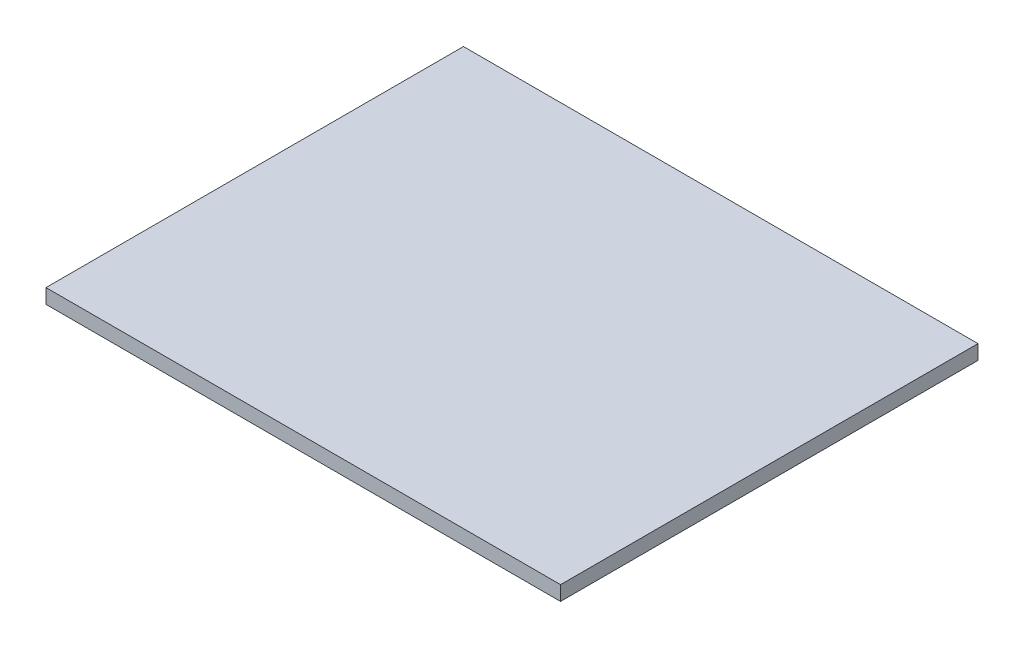
ISO-10303-21;
HEADER;
FILE_DESCRIPTION(('STEP AP214'),'2;1');
FILE_NAME('part.step','',(''),(''),'','','');
FILE_SCHEMA(('AUTOMOTIVE_DESIGN { 1 0 10303 214 1 1 1 1 }'));
ENDSEC;
DATA;
#1=APPLICATION_CONTEXT('core data for automotive mechanical design processes');
#2=APPLICATION_PROTOCOL_DEFINITION('international standard','automotive_design',2000,#1);
#3=PRODUCT_CONTEXT('',#1,'mechanical');
#4=PRODUCT('Part','Part','',(#3));
#5=PRODUCT_RELATED_PRODUCT_CATEGORY('part','',(#4));
#6=PRODUCT_DEFINITION_FORMATION('','',#4);
#7=PRODUCT_DEFINITION_CONTEXT('part definition',#1,'design');
#8=PRODUCT_DEFINITION('design','',#6,#7);
#9=PRODUCT_DEFINITION_SHAPE('','',#8);
#10=(LENGTH_UNIT() NAMED_UNIT(*) SI_UNIT(.MILLI.,.METRE.));
#11=(NAMED_UNIT(*) PLANE_ANGLE_UNIT() SI_UNIT($,.RADIAN.));
#12=(NAMED_UNIT(*) SI_UNIT($,.STERADIAN.) SOLID_ANGLE_UNIT());
#13=UNCERTAINTY_MEASURE_WITH_UNIT(LENGTH_MEASURE(1.E-05),#10,'distance_accuracy_value','');
#14=(GEOMETRIC_REPRESENTATION_CONTEXT(3) GLOBAL_UNCERTAINTY_ASSIGNED_CONTEXT((#13)) GLOBAL_UNIT_ASSIGNED_CONTEXT((#10,
#11,#12)) REPRESENTATION_CONTEXT('',''));
#15=CARTESIAN_POINT('',(0.,0.,0.));
#16=DIRECTION('',(0.,0.,1.));
#17=DIRECTION('',(1.,0.,0.));
#18=AXIS2_PLACEMENT_3D('',#15,#16,#17);
#19=CARTESIAN_POINT('',(-29.4786821705427,1.5,-11.5038759689922));
#20=DIRECTION('',(1.,0.,0.));
#21=DIRECTION('',(0.,0.,-1.));
#22=AXIS2_PLACEMENT_3D('',#19,#20,#21);
#23=PLANE('',#22);
#24=DIRECTION('',(0.,0.,1.));
#25=VECTOR('',#24,1.);
#26=CARTESIAN_POINT('',(-29.4786821705427,0.,-11.5038759689922));
#27=LINE('',#26,#25);
#28=CARTESIAN_POINT('',(-29.4786821705427,0.,-11.5038759689922));
#29=VERTEX_POINT('',#28);
#30=CARTESIAN_POINT('',(-29.4786821705426,0.,31.4961240310077));
#31=VERTEX_POINT('',#30);
#32=EDGE_CURVE('E96',#29,#31,#27,.T.);
#33=ORIENTED_EDGE('',*,*,#32,.T.);
#34=DIRECTION('',(0.,-1.,0.));
#35=VECTOR('',#34,1.);
#36=CARTESIAN_POINT('',(-29.4786821705426,1.5,31.4961240310077));
#37=LINE('',#36,#35);
#38=CARTESIAN_POINT('',(-29.4786821705426,1.5,31.4961240310077));
#39=VERTEX_POINT('',#38);
#40=EDGE_CURVE('E11',#39,#31,#37,.T.);
#41=ORIENTED_EDGE('',*,*,#40,.F.);
#42=DIRECTION('',(0.,0.,1.));
#43=VECTOR('',#42,1.);
#44=CARTESIAN_POINT('',(-29.4786821705427,1.5,-11.5038759689922));
#45=LINE('',#44,#43);
#46=CARTESIAN_POINT('',(-29.4786821705427,1.5,-11.5038759689922));
#47=VERTEX_POINT('',#46);
#48=EDGE_CURVE('E84',#47,#39,#45,.T.);
#49=ORIENTED_EDGE('',*,*,#48,.F.);
#50=DIRECTION('',(0.,-1.,0.));
#51=VECTOR('',#50,1.);
#52=CARTESIAN_POINT('',(-29.4786821705427,1.5,-11.5038759689922));
#53=LINE('',#52,#51);
#54=EDGE_CURVE('E92',#47,#29,#53,.T.);
#55=ORIENTED_EDGE('',*,*,#54,.T.);
#56=EDGE_LOOP('',(#33,#41,#49,#55));
#57=FACE_BOUND('',#56,.T.);
#58=ADVANCED_FACE('F33',(#57),#23,.F.);
#59=CARTESIAN_POINT('',(-29.4786821705426,1.5,31.4961240310077));
#60=DIRECTION('',(0.,0.,-1.));
#61=DIRECTION('',(-1.,0.,0.));
#62=AXIS2_PLACEMENT_3D('',#59,#60,#61);
#63=PLANE('',#62);
#64=DIRECTION('',(1.,0.,0.));
#65=VECTOR('',#64,1.);
#66=CARTESIAN_POINT('',(-29.4786821705426,0.,31.4961240310077));
#67=LINE('',#66,#65);
#68=CARTESIAN_POINT('',(23.5213178294573,0.,31.4961240310077));
#69=VERTEX_POINT('',#68);
#70=EDGE_CURVE('E88',#31,#69,#67,.T.);
#71=ORIENTED_EDGE('',*,*,#70,.T.);
#72=DIRECTION('',(0.,-1.,0.));
#73=VECTOR('',#72,1.);
#74=CARTESIAN_POINT('',(23.5213178294573,1.5,31.4961240310077));
#75=LINE('',#74,#73);
#76=CARTESIAN_POINT('',(23.5213178294573,1.5,31.4961240310077));
#77=VERTEX_POINT('',#76);
#78=EDGE_CURVE('E41',#77,#69,#75,.T.);
#79=ORIENTED_EDGE('',*,*,#78,.F.);
#80=DIRECTION('',(1.,0.,0.));
#81=VECTOR('',#80,1.);
#82=CARTESIAN_POINT('',(-29.4786821705426,1.5,31.4961240310077));
#83=LINE('',#82,#81);
#84=EDGE_CURVE('E79',#39,#77,#83,.T.);
#85=ORIENTED_EDGE('',*,*,#84,.F.);
#86=ORIENTED_EDGE('',*,*,#40,.T.);
#87=EDGE_LOOP('',(#71,#79,#85,#86));
#88=FACE_BOUND('',#87,.T.);
#89=ADVANCED_FACE('F87',(#88),#63,.F.);
#90=CARTESIAN_POINT('',(23.5213178294573,1.5,-11.5038759689922));
#91=DIRECTION('',(-1.,0.,0.));
#92=DIRECTION('',(0.,0.,1.));
#93=AXIS2_PLACEMENT_3D('',#90,#91,#92);
#94=PLANE('',#93);
#95=DIRECTION('',(0.,0.,-1.));
#96=VECTOR('',#95,1.);
#97=CARTESIAN_POINT('',(23.5213178294573,0.,-11.5038759689922));
#98=LINE('',#97,#96);
#99=CARTESIAN_POINT('',(23.5213178294573,0.,-11.5038759689922));
#100=VERTEX_POINT('',#99);
#101=EDGE_CURVE('E66',#69,#100,#98,.T.);
#102=ORIENTED_EDGE('',*,*,#101,.T.);
#103=DIRECTION('',(0.,-1.,0.));
#104=VECTOR('',#103,1.);
#105=CARTESIAN_POINT('',(23.5213178294573,1.5,-11.5038759689922));
#106=LINE('',#105,#104);
#107=CARTESIAN_POINT('',(23.5213178294573,1.5,-11.5038759689922));
#108=VERTEX_POINT('',#107);
#109=EDGE_CURVE('E89',#108,#100,#106,.T.);
#110=ORIENTED_EDGE('',*,*,#109,.F.);
#111=DIRECTION('',(0.,0.,-1.));
#112=VECTOR('',#111,1.);
#113=CARTESIAN_POINT('',(23.5213178294573,1.5,-11.5038759689922));
#114=LINE('',#113,#112);
#115=EDGE_CURVE('E82',#77,#108,#114,.T.);
#116=ORIENTED_EDGE('',*,*,#115,.F.);
#117=ORIENTED_EDGE('',*,*,#78,.T.);
#118=EDGE_LOOP('',(#102,#110,#116,#117));
#119=FACE_BOUND('',#118,.T.);
#120=ADVANCED_FACE('F90',(#119),#94,.F.);
#121=CARTESIAN_POINT('',(-29.4786821705427,1.5,-11.5038759689922));
#122=DIRECTION('',(0.,0.,1.));
#123=DIRECTION('',(1.,0.,0.));
#124=AXIS2_PLACEMENT_3D('',#121,#122,#123);
#125=PLANE('',#124);
#126=DIRECTION('',(-1.,0.,0.));
#127=VECTOR('',#126,1.);
#128=CARTESIAN_POINT('',(-29.4786821705427,0.,-11.5038759689922));
#129=LINE('',#128,#127);
#130=EDGE_CURVE('E72',#100,#29,#129,.T.);
#131=ORIENTED_EDGE('',*,*,#130,.T.);
#132=ORIENTED_EDGE('',*,*,#54,.F.);
#133=DIRECTION('',(-1.,0.,0.));
#134=VECTOR('',#133,1.);
#135=CARTESIAN_POINT('',(-29.4786821705427,1.5,-11.5038759689922));
#136=LINE('',#135,#134);
#137=EDGE_CURVE('E49',#108,#47,#136,.T.);
#138=ORIENTED_EDGE('',*,*,#137,.F.);
#139=ORIENTED_EDGE('',*,*,#109,.T.);
#140=EDGE_LOOP('',(#131,#132,#138,#139));
#141=FACE_BOUND('',#140,.T.);
#142=ADVANCED_FACE('F103',(#141),#125,.F.);
#143=CARTESIAN_POINT('',(0.,1.5,0.));
#144=DIRECTION('',(0.,1.,0.));
#145=DIRECTION('',(0.,0.,1.));
#146=AXIS2_PLACEMENT_3D('',#143,#144,#145);
#147=PLANE('',#146);
#148=ORIENTED_EDGE('',*,*,#48,.T.);
#149=ORIENTED_EDGE('',*,*,#84,.T.);
#150=ORIENTED_EDGE('',*,*,#115,.T.);
#151=ORIENTED_EDGE('',*,*,#137,.T.);
#152=EDGE_LOOP('',(#148,#149,#150,#151));
#153=FACE_BOUND('',#152,.T.);
#154=ADVANCED_FACE('F80',(#153),#147,.T.);
#155=CARTESIAN_POINT('',(0.,0.,0.));
#156=DIRECTION('',(0.,1.,0.));
#157=DIRECTION('',(0.,0.,1.));
#158=AXIS2_PLACEMENT_3D('',#155,#156,#157);
#159=PLANE('',#158);
#160=ORIENTED_EDGE('',*,*,#32,.F.);
#161=ORIENTED_EDGE('',*,*,#130,.F.);
#162=ORIENTED_EDGE('',*,*,#101,.F.);
#163=ORIENTED_EDGE('',*,*,#70,.F.);
#164=EDGE_LOOP('',(#160,#161,#162,#163));
#165=FACE_BOUND('',#164,.T.);
#166=ADVANCED_FACE('F106',(#165),#159,.F.);
#167=CLOSED_SHELL('',(#58,#89,#120,#142,#154,#166));
#168=MANIFOLD_SOLID_BREP('B2',#167);
#169=ADVANCED_BREP_SHAPE_REPRESENTATION('',(#18,#168),#14);
#170=SHAPE_DEFINITION_REPRESENTATION(#9,#169);
ENDSEC;
END-ISO-10303-21;
